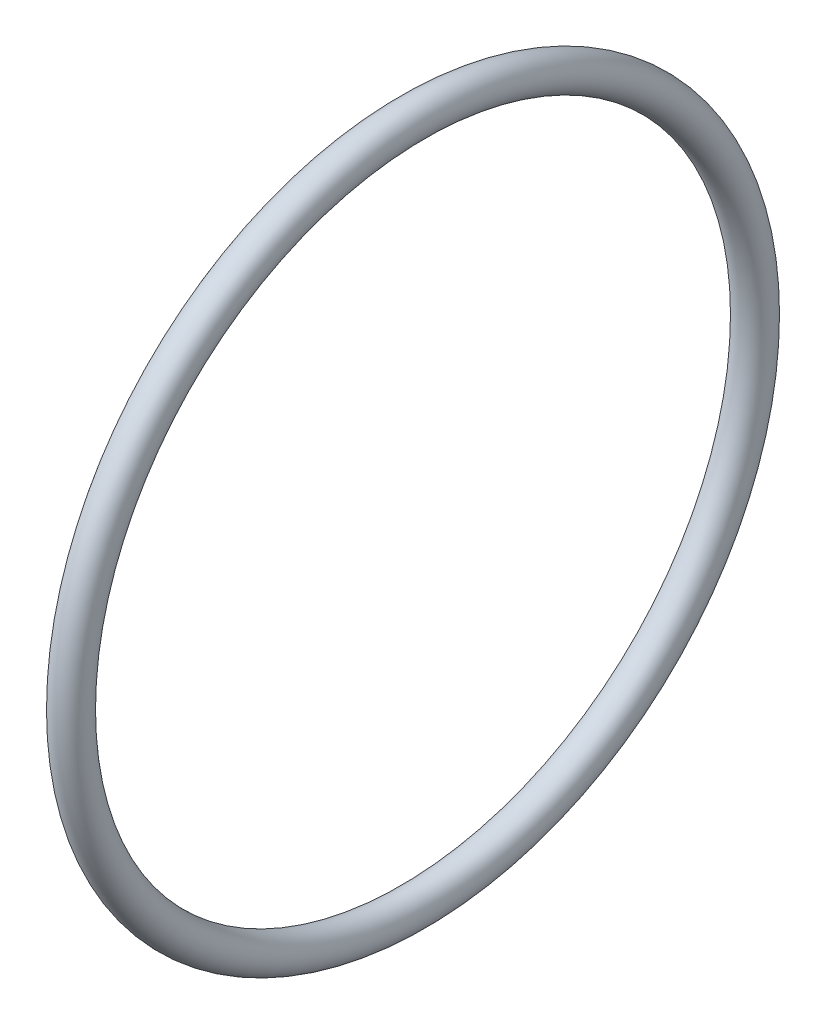
ISO-10303-21;
HEADER;
FILE_DESCRIPTION(('STEP AP214'),'2;1');
FILE_NAME('part.step','',(''),(''),'','','');
FILE_SCHEMA(('AUTOMOTIVE_DESIGN { 1 0 10303 214 1 1 1 1 }'));
ENDSEC;
DATA;
#1=APPLICATION_CONTEXT('core data for automotive mechanical design processes');
#2=APPLICATION_PROTOCOL_DEFINITION('international standard','automotive_design',2000,#1);
#3=PRODUCT_CONTEXT('',#1,'mechanical');
#4=PRODUCT('Part','Part','',(#3));
#5=PRODUCT_RELATED_PRODUCT_CATEGORY('part','',(#4));
#6=PRODUCT_DEFINITION_FORMATION('','',#4);
#7=PRODUCT_DEFINITION_CONTEXT('part definition',#1,'design');
#8=PRODUCT_DEFINITION('design','',#6,#7);
#9=PRODUCT_DEFINITION_SHAPE('','',#8);
#10=(LENGTH_UNIT() NAMED_UNIT(*) SI_UNIT(.MILLI.,.METRE.));
#11=(NAMED_UNIT(*) PLANE_ANGLE_UNIT() SI_UNIT($,.RADIAN.));
#12=(NAMED_UNIT(*) SI_UNIT($,.STERADIAN.) SOLID_ANGLE_UNIT());
#13=UNCERTAINTY_MEASURE_WITH_UNIT(LENGTH_MEASURE(1.E-05),#10,'distance_accuracy_value','');
#14=(GEOMETRIC_REPRESENTATION_CONTEXT(3) GLOBAL_UNCERTAINTY_ASSIGNED_CONTEXT((#13)) GLOBAL_UNIT_ASSIGNED_CONTEXT((#10,
#11,#12)) REPRESENTATION_CONTEXT('',''));
#15=CARTESIAN_POINT('',(0.,0.,0.));
#16=DIRECTION('',(0.,0.,1.));
#17=DIRECTION('',(1.,0.,0.));
#18=AXIS2_PLACEMENT_3D('',#15,#16,#17);
#19=CARTESIAN_POINT('',(0.,0.,0.));
#20=DIRECTION('',(-1.,0.,0.));
#21=DIRECTION('',(0.,0.,1.));
#22=AXIS2_PLACEMENT_3D('',#19,#20,#21);
#23=TOROIDAL_SURFACE('',#22,19.715,1.);
#24=CARTESIAN_POINT('',(0.,0.,20.715));
#25=VERTEX_POINT('',#24);
#26=VERTEX_LOOP('',#25);
#27=FACE_BOUND('',#26,.T.);
#28=ADVANCED_FACE('F29',(#27),#23,.T.);
#29=CLOSED_SHELL('',(#28));
#30=MANIFOLD_SOLID_BREP('B2',#29);
#31=ADVANCED_BREP_SHAPE_REPRESENTATION('',(#18,#30),#14);
#32=SHAPE_DEFINITION_REPRESENTATION(#9,#31);
ENDSEC;
END-ISO-10303-21;
